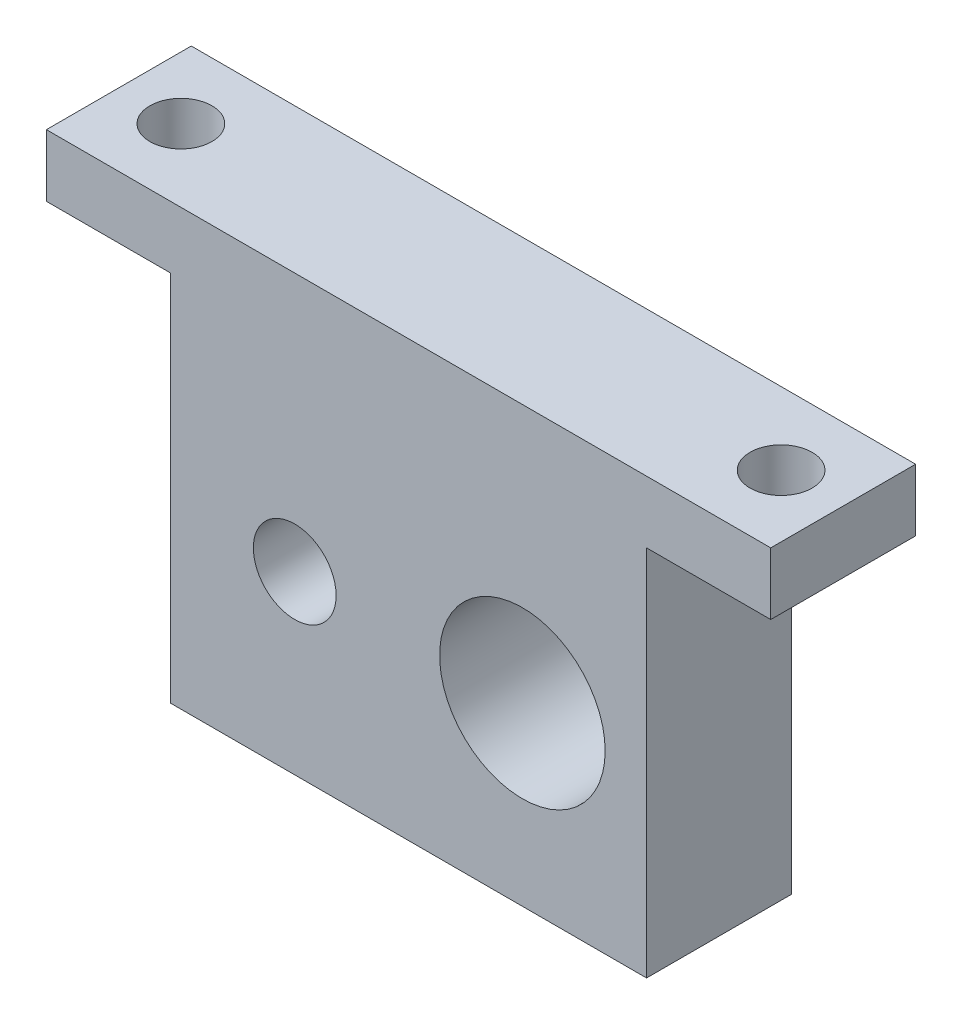
ISO-10303-21;
HEADER;
FILE_DESCRIPTION(('STEP AP214'),'2;1');
FILE_NAME('part.step','',(''),(''),'','','');
FILE_SCHEMA(('AUTOMOTIVE_DESIGN { 1 0 10303 214 1 1 1 1 }'));
ENDSEC;
DATA;
#1=APPLICATION_CONTEXT('core data for automotive mechanical design processes');
#2=APPLICATION_PROTOCOL_DEFINITION('international standard','automotive_design',2000,#1);
#3=PRODUCT_CONTEXT('',#1,'mechanical');
#4=PRODUCT('Part','Part','',(#3));
#5=PRODUCT_RELATED_PRODUCT_CATEGORY('part','',(#4));
#6=PRODUCT_DEFINITION_FORMATION('','',#4);
#7=PRODUCT_DEFINITION_CONTEXT('part definition',#1,'design');
#8=PRODUCT_DEFINITION('design','',#6,#7);
#9=PRODUCT_DEFINITION_SHAPE('','',#8);
#10=(LENGTH_UNIT() NAMED_UNIT(*) SI_UNIT(.MILLI.,.METRE.));
#11=(NAMED_UNIT(*) PLANE_ANGLE_UNIT() SI_UNIT($,.RADIAN.));
#12=(NAMED_UNIT(*) SI_UNIT($,.STERADIAN.) SOLID_ANGLE_UNIT());
#13=UNCERTAINTY_MEASURE_WITH_UNIT(LENGTH_MEASURE(1.E-05),#10,'distance_accuracy_value','');
#14=(GEOMETRIC_REPRESENTATION_CONTEXT(3) GLOBAL_UNCERTAINTY_ASSIGNED_CONTEXT((#13)) GLOBAL_UNIT_ASSIGNED_CONTEXT((#10,
#11,#12)) REPRESENTATION_CONTEXT('',''));
#15=CARTESIAN_POINT('',(0.,0.,0.));
#16=DIRECTION('',(0.,0.,1.));
#17=DIRECTION('',(1.,0.,0.));
#18=AXIS2_PLACEMENT_3D('',#15,#16,#17);
#19=CARTESIAN_POINT('',(23.,0.,14.));
#20=DIRECTION('',(1.,0.,0.));
#21=DIRECTION('',(0.,1.,0.));
#22=AXIS2_PLACEMENT_3D('',#19,#20,#21);
#23=PLANE('',#22);
#24=DIRECTION('',(0.,-1.,0.));
#25=VECTOR('',#24,1.);
#26=CARTESIAN_POINT('',(23.,0.,0.));
#27=LINE('',#26,#25);
#28=CARTESIAN_POINT('',(23.,15.,0.));
#29=VERTEX_POINT('',#28);
#30=CARTESIAN_POINT('',(23.,-21.,0.));
#31=VERTEX_POINT('',#30);
#32=EDGE_CURVE('E158',#29,#31,#27,.T.);
#33=ORIENTED_EDGE('',*,*,#32,.F.);
#34=DIRECTION('',(0.,0.,-1.));
#35=VECTOR('',#34,1.);
#36=CARTESIAN_POINT('',(23.,15.,14.));
#37=LINE('',#36,#35);
#38=CARTESIAN_POINT('',(23.,15.,14.));
#39=VERTEX_POINT('',#38);
#40=EDGE_CURVE('E11',#39,#29,#37,.T.);
#41=ORIENTED_EDGE('',*,*,#40,.F.);
#42=DIRECTION('',(0.,-1.,0.));
#43=VECTOR('',#42,1.);
#44=CARTESIAN_POINT('',(23.,0.,14.));
#45=LINE('',#44,#43);
#46=CARTESIAN_POINT('',(23.,-21.,14.));
#47=VERTEX_POINT('',#46);
#48=EDGE_CURVE('E247',#39,#47,#45,.T.);
#49=ORIENTED_EDGE('',*,*,#48,.T.);
#50=DIRECTION('',(0.,0.,-1.));
#51=VECTOR('',#50,1.);
#52=CARTESIAN_POINT('',(23.,-21.,14.));
#53=LINE('',#52,#51);
#54=EDGE_CURVE('E87',#47,#31,#53,.T.);
#55=ORIENTED_EDGE('',*,*,#54,.T.);
#56=EDGE_LOOP('',(#33,#41,#49,#55));
#57=FACE_BOUND('',#56,.T.);
#58=ADVANCED_FACE('F35',(#57),#23,.T.);
#59=CARTESIAN_POINT('',(0.,15.,14.));
#60=DIRECTION('',(0.,-1.,0.));
#61=DIRECTION('',(1.,0.,0.));
#62=AXIS2_PLACEMENT_3D('',#59,#60,#61);
#63=PLANE('',#62);
#64=CARTESIAN_POINT('',(29.,15.,7.));
#65=DIRECTION('',(0.,-1.,0.));
#66=DIRECTION('',(1.,0.,0.));
#67=AXIS2_PLACEMENT_3D('',#64,#65,#66);
#68=CIRCLE('',#67,3.);
#69=CARTESIAN_POINT('',(32.,15.,7.));
#70=VERTEX_POINT('',#69);
#71=EDGE_CURVE('E235',#70,#70,#68,.T.);
#72=ORIENTED_EDGE('',*,*,#71,.F.);
#73=EDGE_LOOP('',(#72));
#74=FACE_BOUND('',#73,.T.);
#75=DIRECTION('',(-1.,0.,0.));
#76=VECTOR('',#75,1.);
#77=CARTESIAN_POINT('',(0.,15.,0.));
#78=LINE('',#77,#76);
#79=CARTESIAN_POINT('',(35.,15.,0.));
#80=VERTEX_POINT('',#79);
#81=EDGE_CURVE('E152',#80,#29,#78,.T.);
#82=ORIENTED_EDGE('',*,*,#81,.F.);
#83=DIRECTION('',(0.,0.,-1.));
#84=VECTOR('',#83,1.);
#85=CARTESIAN_POINT('',(35.,15.,14.));
#86=LINE('',#85,#84);
#87=CARTESIAN_POINT('',(35.,15.,14.));
#88=VERTEX_POINT('',#87);
#89=EDGE_CURVE('E45',#88,#80,#86,.T.);
#90=ORIENTED_EDGE('',*,*,#89,.F.);
#91=DIRECTION('',(-1.,0.,0.));
#92=VECTOR('',#91,1.);
#93=CARTESIAN_POINT('',(0.,15.,14.));
#94=LINE('',#93,#92);
#95=EDGE_CURVE('E249',#88,#39,#94,.T.);
#96=ORIENTED_EDGE('',*,*,#95,.T.);
#97=ORIENTED_EDGE('',*,*,#40,.T.);
#98=EDGE_LOOP('',(#82,#90,#96,#97));
#99=FACE_BOUND('',#98,.T.);
#100=ADVANCED_FACE('F157',(#74,#99),#63,.T.);
#101=CARTESIAN_POINT('',(35.,0.,14.));
#102=DIRECTION('',(-1.,0.,0.));
#103=DIRECTION('',(0.,-1.,0.));
#104=AXIS2_PLACEMENT_3D('',#101,#102,#103);
#105=PLANE('',#104);
#106=DIRECTION('',(0.,1.,0.));
#107=VECTOR('',#106,1.);
#108=CARTESIAN_POINT('',(35.,0.,0.));
#109=LINE('',#108,#107);
#110=CARTESIAN_POINT('',(35.,21.,0.));
#111=VERTEX_POINT('',#110);
#112=EDGE_CURVE('E143',#80,#111,#109,.T.);
#113=ORIENTED_EDGE('',*,*,#112,.T.);
#114=DIRECTION('',(0.,0.,-1.));
#115=VECTOR('',#114,1.);
#116=CARTESIAN_POINT('',(35.,21.,14.));
#117=LINE('',#116,#115);
#118=CARTESIAN_POINT('',(35.,21.,14.));
#119=VERTEX_POINT('',#118);
#120=EDGE_CURVE('E135',#119,#111,#117,.T.);
#121=ORIENTED_EDGE('',*,*,#120,.F.);
#122=DIRECTION('',(0.,1.,0.));
#123=VECTOR('',#122,1.);
#124=CARTESIAN_POINT('',(35.,0.,14.));
#125=LINE('',#124,#123);
#126=EDGE_CURVE('E145',#88,#119,#125,.T.);
#127=ORIENTED_EDGE('',*,*,#126,.F.);
#128=ORIENTED_EDGE('',*,*,#89,.T.);
#129=EDGE_LOOP('',(#113,#121,#127,#128));
#130=FACE_BOUND('',#129,.T.);
#131=ADVANCED_FACE('F141',(#130),#105,.F.);
#132=CARTESIAN_POINT('',(0.,21.,14.));
#133=DIRECTION('',(0.,1.,0.));
#134=DIRECTION('',(-1.,0.,0.));
#135=AXIS2_PLACEMENT_3D('',#132,#133,#134);
#136=PLANE('',#135);
#137=CARTESIAN_POINT('',(29.,21.,7.));
#138=DIRECTION('',(0.,1.,0.));
#139=DIRECTION('',(-1.,0.,0.));
#140=AXIS2_PLACEMENT_3D('',#137,#138,#139);
#141=CIRCLE('',#140,3.);
#142=CARTESIAN_POINT('',(26.,21.,7.));
#143=VERTEX_POINT('',#142);
#144=EDGE_CURVE('E39',#143,#143,#141,.T.);
#145=ORIENTED_EDGE('',*,*,#144,.F.);
#146=EDGE_LOOP('',(#145));
#147=FACE_BOUND('',#146,.T.);
#148=CARTESIAN_POINT('',(-29.,21.,7.));
#149=DIRECTION('',(0.,1.,0.));
#150=DIRECTION('',(-1.,0.,0.));
#151=AXIS2_PLACEMENT_3D('',#148,#149,#150);
#152=CIRCLE('',#151,3.);
#153=CARTESIAN_POINT('',(-32.,21.,7.));
#154=VERTEX_POINT('',#153);
#155=EDGE_CURVE('E175',#154,#154,#152,.T.);
#156=ORIENTED_EDGE('',*,*,#155,.F.);
#157=EDGE_LOOP('',(#156));
#158=FACE_BOUND('',#157,.T.);
#159=DIRECTION('',(1.,0.,0.));
#160=VECTOR('',#159,1.);
#161=CARTESIAN_POINT('',(0.,21.,0.));
#162=LINE('',#161,#160);
#163=CARTESIAN_POINT('',(-35.,21.,0.));
#164=VERTEX_POINT('',#163);
#165=EDGE_CURVE('E155',#164,#111,#162,.T.);
#166=ORIENTED_EDGE('',*,*,#165,.F.);
#167=DIRECTION('',(0.,0.,-1.));
#168=VECTOR('',#167,1.);
#169=CARTESIAN_POINT('',(-35.,21.,14.));
#170=LINE('',#169,#168);
#171=CARTESIAN_POINT('',(-35.,21.,14.));
#172=VERTEX_POINT('',#171);
#173=EDGE_CURVE('E129',#172,#164,#170,.T.);
#174=ORIENTED_EDGE('',*,*,#173,.F.);
#175=DIRECTION('',(1.,0.,0.));
#176=VECTOR('',#175,1.);
#177=CARTESIAN_POINT('',(0.,21.,14.));
#178=LINE('',#177,#176);
#179=EDGE_CURVE('E252',#172,#119,#178,.T.);
#180=ORIENTED_EDGE('',*,*,#179,.T.);
#181=ORIENTED_EDGE('',*,*,#120,.T.);
#182=EDGE_LOOP('',(#166,#174,#180,#181));
#183=FACE_BOUND('',#182,.T.);
#184=ADVANCED_FACE('F201',(#147,#158,#183),#136,.T.);
#185=CARTESIAN_POINT('',(-35.,0.,14.));
#186=DIRECTION('',(-1.,0.,0.));
#187=DIRECTION('',(0.,-1.,0.));
#188=AXIS2_PLACEMENT_3D('',#185,#186,#187);
#189=PLANE('',#188);
#190=DIRECTION('',(0.,1.,0.));
#191=VECTOR('',#190,1.);
#192=CARTESIAN_POINT('',(-35.,0.,0.));
#193=LINE('',#192,#191);
#194=CARTESIAN_POINT('',(-35.,15.,0.));
#195=VERTEX_POINT('',#194);
#196=EDGE_CURVE('E165',#195,#164,#193,.T.);
#197=ORIENTED_EDGE('',*,*,#196,.F.);
#198=DIRECTION('',(0.,0.,-1.));
#199=VECTOR('',#198,1.);
#200=CARTESIAN_POINT('',(-35.,15.,14.));
#201=LINE('',#200,#199);
#202=CARTESIAN_POINT('',(-35.,15.,14.));
#203=VERTEX_POINT('',#202);
#204=EDGE_CURVE('E127',#203,#195,#201,.T.);
#205=ORIENTED_EDGE('',*,*,#204,.F.);
#206=DIRECTION('',(0.,1.,0.));
#207=VECTOR('',#206,1.);
#208=CARTESIAN_POINT('',(-35.,0.,14.));
#209=LINE('',#208,#207);
#210=EDGE_CURVE('E121',#203,#172,#209,.T.);
#211=ORIENTED_EDGE('',*,*,#210,.T.);
#212=ORIENTED_EDGE('',*,*,#173,.T.);
#213=EDGE_LOOP('',(#197,#205,#211,#212));
#214=FACE_BOUND('',#213,.T.);
#215=ADVANCED_FACE('F204',(#214),#189,.T.);
#216=CARTESIAN_POINT('',(0.,15.,14.));
#217=DIRECTION('',(0.,1.,0.));
#218=DIRECTION('',(-1.,0.,0.));
#219=AXIS2_PLACEMENT_3D('',#216,#217,#218);
#220=PLANE('',#219);
#221=CARTESIAN_POINT('',(-29.,15.,7.));
#222=DIRECTION('',(0.,-1.,0.));
#223=DIRECTION('',(1.,0.,0.));
#224=AXIS2_PLACEMENT_3D('',#221,#222,#223);
#225=CIRCLE('',#224,3.);
#226=CARTESIAN_POINT('',(-26.,15.,7.));
#227=VERTEX_POINT('',#226);
#228=EDGE_CURVE('E237',#227,#227,#225,.T.);
#229=ORIENTED_EDGE('',*,*,#228,.F.);
#230=EDGE_LOOP('',(#229));
#231=FACE_BOUND('',#230,.T.);
#232=DIRECTION('',(1.,0.,0.));
#233=VECTOR('',#232,1.);
#234=CARTESIAN_POINT('',(0.,15.,0.));
#235=LINE('',#234,#233);
#236=CARTESIAN_POINT('',(-23.,15.,0.));
#237=VERTEX_POINT('',#236);
#238=EDGE_CURVE('E126',#195,#237,#235,.T.);
#239=ORIENTED_EDGE('',*,*,#238,.T.);
#240=DIRECTION('',(0.,0.,-1.));
#241=VECTOR('',#240,1.);
#242=CARTESIAN_POINT('',(-23.,15.,14.));
#243=LINE('',#242,#241);
#244=CARTESIAN_POINT('',(-23.,15.,14.));
#245=VERTEX_POINT('',#244);
#246=EDGE_CURVE('E111',#245,#237,#243,.T.);
#247=ORIENTED_EDGE('',*,*,#246,.F.);
#248=DIRECTION('',(1.,0.,0.));
#249=VECTOR('',#248,1.);
#250=CARTESIAN_POINT('',(0.,15.,14.));
#251=LINE('',#250,#249);
#252=EDGE_CURVE('E114',#203,#245,#251,.T.);
#253=ORIENTED_EDGE('',*,*,#252,.F.);
#254=ORIENTED_EDGE('',*,*,#204,.T.);
#255=EDGE_LOOP('',(#239,#247,#253,#254));
#256=FACE_BOUND('',#255,.T.);
#257=ADVANCED_FACE('F124',(#231,#256),#220,.F.);
#258=CARTESIAN_POINT('',(-23.,0.,14.));
#259=DIRECTION('',(1.,0.,0.));
#260=DIRECTION('',(0.,1.,0.));
#261=AXIS2_PLACEMENT_3D('',#258,#259,#260);
#262=PLANE('',#261);
#263=DIRECTION('',(0.,-1.,0.));
#264=VECTOR('',#263,1.);
#265=CARTESIAN_POINT('',(-23.,0.,0.));
#266=LINE('',#265,#264);
#267=CARTESIAN_POINT('',(-23.,-21.,0.));
#268=VERTEX_POINT('',#267);
#269=EDGE_CURVE('E168',#237,#268,#266,.T.);
#270=ORIENTED_EDGE('',*,*,#269,.T.);
#271=DIRECTION('',(0.,0.,-1.));
#272=VECTOR('',#271,1.);
#273=CARTESIAN_POINT('',(-23.,-21.,14.));
#274=LINE('',#273,#272);
#275=CARTESIAN_POINT('',(-23.,-21.,14.));
#276=VERTEX_POINT('',#275);
#277=EDGE_CURVE('E113',#276,#268,#274,.T.);
#278=ORIENTED_EDGE('',*,*,#277,.F.);
#279=DIRECTION('',(0.,-1.,0.));
#280=VECTOR('',#279,1.);
#281=CARTESIAN_POINT('',(-23.,0.,14.));
#282=LINE('',#281,#280);
#283=EDGE_CURVE('E106',#245,#276,#282,.T.);
#284=ORIENTED_EDGE('',*,*,#283,.F.);
#285=ORIENTED_EDGE('',*,*,#246,.T.);
#286=EDGE_LOOP('',(#270,#278,#284,#285));
#287=FACE_BOUND('',#286,.T.);
#288=ADVANCED_FACE('F109',(#287),#262,.F.);
#289=CARTESIAN_POINT('',(-11.,-3.99999999999999,14.));
#290=DIRECTION('',(0.,0.,-1.));
#291=DIRECTION('',(-1.,0.,0.));
#292=AXIS2_PLACEMENT_3D('',#289,#290,#291);
#293=CYLINDRICAL_SURFACE('',#292,4.);
#294=CARTESIAN_POINT('',(-11.,-3.99999999999999,14.));
#295=DIRECTION('',(0.,0.,1.));
#296=DIRECTION('',(1.,0.,0.));
#297=AXIS2_PLACEMENT_3D('',#294,#295,#296);
#298=CIRCLE('',#297,4.);
#299=CARTESIAN_POINT('',(-6.99999999999999,-3.99999999999999,14.));
#300=VERTEX_POINT('',#299);
#301=EDGE_CURVE('E245',#300,#300,#298,.T.);
#302=ORIENTED_EDGE('',*,*,#301,.T.);
#303=EDGE_LOOP('',(#302));
#304=FACE_BOUND('',#303,.T.);
#305=CARTESIAN_POINT('',(-11.,-3.99999999999999,0.));
#306=DIRECTION('',(0.,0.,1.));
#307=DIRECTION('',(1.,0.,0.));
#308=AXIS2_PLACEMENT_3D('',#305,#306,#307);
#309=CIRCLE('',#308,4.);
#310=CARTESIAN_POINT('',(-6.99999999999999,-3.99999999999999,0.));
#311=VERTEX_POINT('',#310);
#312=EDGE_CURVE('E160',#311,#311,#309,.T.);
#313=ORIENTED_EDGE('',*,*,#312,.F.);
#314=EDGE_LOOP('',(#313));
#315=FACE_BOUND('',#314,.T.);
#316=ADVANCED_FACE('F180',(#304,#315),#293,.F.);
#317=CARTESIAN_POINT('',(11.,-3.99999999999999,14.));
#318=DIRECTION('',(0.,0.,-1.));
#319=DIRECTION('',(-1.,0.,0.));
#320=AXIS2_PLACEMENT_3D('',#317,#318,#319);
#321=CYLINDRICAL_SURFACE('',#320,8.);
#322=CARTESIAN_POINT('',(11.,-3.99999999999999,14.));
#323=DIRECTION('',(0.,0.,1.));
#324=DIRECTION('',(1.,0.,0.));
#325=AXIS2_PLACEMENT_3D('',#322,#323,#324);
#326=CIRCLE('',#325,8.);
#327=CARTESIAN_POINT('',(19.,-3.99999999999999,14.));
#328=VERTEX_POINT('',#327);
#329=EDGE_CURVE('E170',#328,#328,#326,.T.);
#330=ORIENTED_EDGE('',*,*,#329,.T.);
#331=EDGE_LOOP('',(#330));
#332=FACE_BOUND('',#331,.T.);
#333=CARTESIAN_POINT('',(11.,-3.99999999999999,0.));
#334=DIRECTION('',(0.,0.,1.));
#335=DIRECTION('',(1.,0.,0.));
#336=AXIS2_PLACEMENT_3D('',#333,#334,#335);
#337=CIRCLE('',#336,8.);
#338=CARTESIAN_POINT('',(19.,-3.99999999999999,0.));
#339=VERTEX_POINT('',#338);
#340=EDGE_CURVE('E173',#339,#339,#337,.T.);
#341=ORIENTED_EDGE('',*,*,#340,.F.);
#342=EDGE_LOOP('',(#341));
#343=FACE_BOUND('',#342,.T.);
#344=ADVANCED_FACE('F37',(#332,#343),#321,.F.);
#345=CARTESIAN_POINT('',(0.,-21.,14.));
#346=DIRECTION('',(0.,1.,0.));
#347=DIRECTION('',(-1.,0.,0.));
#348=AXIS2_PLACEMENT_3D('',#345,#346,#347);
#349=PLANE('',#348);
#350=DIRECTION('',(1.,0.,0.));
#351=VECTOR('',#350,1.);
#352=CARTESIAN_POINT('',(0.,-21.,0.));
#353=LINE('',#352,#351);
#354=EDGE_CURVE('E80',#268,#31,#353,.T.);
#355=ORIENTED_EDGE('',*,*,#354,.T.);
#356=ORIENTED_EDGE('',*,*,#54,.F.);
#357=DIRECTION('',(1.,0.,0.));
#358=VECTOR('',#357,1.);
#359=CARTESIAN_POINT('',(0.,-21.,14.));
#360=LINE('',#359,#358);
#361=EDGE_CURVE('E53',#276,#47,#360,.T.);
#362=ORIENTED_EDGE('',*,*,#361,.F.);
#363=ORIENTED_EDGE('',*,*,#277,.T.);
#364=EDGE_LOOP('',(#355,#356,#362,#363));
#365=FACE_BOUND('',#364,.T.);
#366=ADVANCED_FACE('F187',(#365),#349,.F.);
#367=CARTESIAN_POINT('',(0.,0.,14.));
#368=DIRECTION('',(0.,0.,1.));
#369=DIRECTION('',(1.,0.,0.));
#370=AXIS2_PLACEMENT_3D('',#367,#368,#369);
#371=PLANE('',#370);
#372=ORIENTED_EDGE('',*,*,#329,.F.);
#373=EDGE_LOOP('',(#372));
#374=FACE_BOUND('',#373,.T.);
#375=ORIENTED_EDGE('',*,*,#301,.F.);
#376=EDGE_LOOP('',(#375));
#377=FACE_BOUND('',#376,.T.);
#378=ORIENTED_EDGE('',*,*,#48,.F.);
#379=ORIENTED_EDGE('',*,*,#95,.F.);
#380=ORIENTED_EDGE('',*,*,#126,.T.);
#381=ORIENTED_EDGE('',*,*,#179,.F.);
#382=ORIENTED_EDGE('',*,*,#210,.F.);
#383=ORIENTED_EDGE('',*,*,#252,.T.);
#384=ORIENTED_EDGE('',*,*,#283,.T.);
#385=ORIENTED_EDGE('',*,*,#361,.T.);
#386=EDGE_LOOP('',(#378,#379,#380,#381,#382,#383,#384,#385));
#387=FACE_BOUND('',#386,.T.);
#388=ADVANCED_FACE('F118',(#374,#377,#387),#371,.T.);
#389=CARTESIAN_POINT('',(0.,0.,0.));
#390=DIRECTION('',(0.,0.,1.));
#391=DIRECTION('',(1.,0.,0.));
#392=AXIS2_PLACEMENT_3D('',#389,#390,#391);
#393=PLANE('',#392);
#394=ORIENTED_EDGE('',*,*,#340,.T.);
#395=EDGE_LOOP('',(#394));
#396=FACE_BOUND('',#395,.T.);
#397=ORIENTED_EDGE('',*,*,#312,.T.);
#398=EDGE_LOOP('',(#397));
#399=FACE_BOUND('',#398,.T.);
#400=ORIENTED_EDGE('',*,*,#32,.T.);
#401=ORIENTED_EDGE('',*,*,#354,.F.);
#402=ORIENTED_EDGE('',*,*,#269,.F.);
#403=ORIENTED_EDGE('',*,*,#238,.F.);
#404=ORIENTED_EDGE('',*,*,#196,.T.);
#405=ORIENTED_EDGE('',*,*,#165,.T.);
#406=ORIENTED_EDGE('',*,*,#112,.F.);
#407=ORIENTED_EDGE('',*,*,#81,.T.);
#408=EDGE_LOOP('',(#400,#401,#402,#403,#404,#405,#406,#407));
#409=FACE_BOUND('',#408,.T.);
#410=ADVANCED_FACE('F151',(#396,#399,#409),#393,.F.);
#411=CARTESIAN_POINT('',(-29.,29.,7.));
#412=DIRECTION('',(0.,-1.,0.));
#413=DIRECTION('',(1.,0.,0.));
#414=AXIS2_PLACEMENT_3D('',#411,#412,#413);
#415=CYLINDRICAL_SURFACE('',#414,3.);
#416=ORIENTED_EDGE('',*,*,#155,.T.);
#417=EDGE_LOOP('',(#416));
#418=FACE_BOUND('',#417,.T.);
#419=ORIENTED_EDGE('',*,*,#228,.T.);
#420=EDGE_LOOP('',(#419));
#421=FACE_BOUND('',#420,.T.);
#422=ADVANCED_FACE('F217',(#418,#421),#415,.F.);
#423=CARTESIAN_POINT('',(29.,29.,7.));
#424=DIRECTION('',(0.,-1.,0.));
#425=DIRECTION('',(1.,0.,0.));
#426=AXIS2_PLACEMENT_3D('',#423,#424,#425);
#427=CYLINDRICAL_SURFACE('',#426,3.);
#428=ORIENTED_EDGE('',*,*,#144,.T.);
#429=EDGE_LOOP('',(#428));
#430=FACE_BOUND('',#429,.T.);
#431=ORIENTED_EDGE('',*,*,#71,.T.);
#432=EDGE_LOOP('',(#431));
#433=FACE_BOUND('',#432,.T.);
#434=ADVANCED_FACE('F224',(#430,#433),#427,.F.);
#435=CLOSED_SHELL('',(#58,#100,#131,#184,#215,#257,#288,#316,#344,#366,#388,#410,#422,#434));
#436=MANIFOLD_SOLID_BREP('B2',#435);
#437=ADVANCED_BREP_SHAPE_REPRESENTATION('',(#18,#436),#14);
#438=SHAPE_DEFINITION_REPRESENTATION(#9,#437);
ENDSEC;
END-ISO-10303-21;
